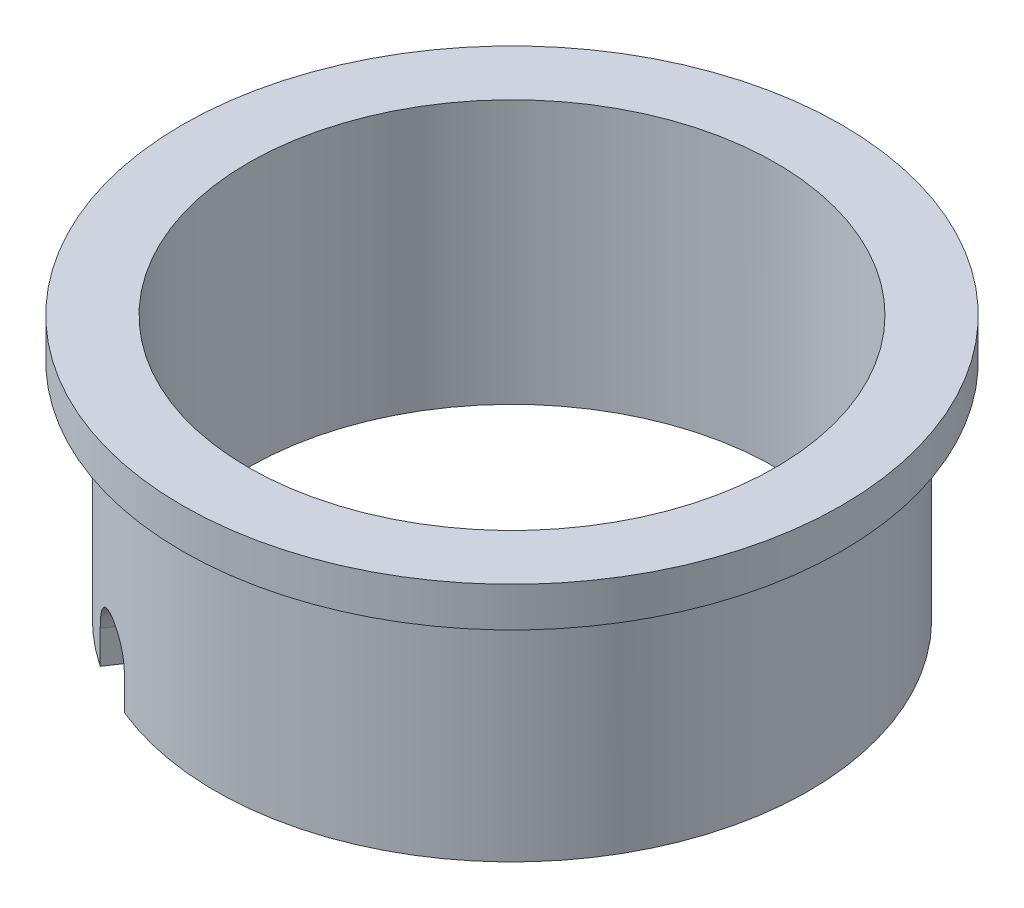
ISO-10303-21;
HEADER;
FILE_DESCRIPTION(('STEP AP214'),'2;1');
FILE_NAME('part.step','',(''),(''),'','','');
FILE_SCHEMA(('AUTOMOTIVE_DESIGN { 1 0 10303 214 1 1 1 1 }'));
ENDSEC;
DATA;
#1=APPLICATION_CONTEXT('core data for automotive mechanical design processes');
#2=APPLICATION_PROTOCOL_DEFINITION('international standard','automotive_design',2000,#1);
#3=PRODUCT_CONTEXT('',#1,'mechanical');
#4=PRODUCT('Part','Part','',(#3));
#5=PRODUCT_RELATED_PRODUCT_CATEGORY('part','',(#4));
#6=PRODUCT_DEFINITION_FORMATION('','',#4);
#7=PRODUCT_DEFINITION_CONTEXT('part definition',#1,'design');
#8=PRODUCT_DEFINITION('design','',#6,#7);
#9=PRODUCT_DEFINITION_SHAPE('','',#8);
#10=(LENGTH_UNIT() NAMED_UNIT(*) SI_UNIT(.MILLI.,.METRE.));
#11=(NAMED_UNIT(*) PLANE_ANGLE_UNIT() SI_UNIT($,.RADIAN.));
#12=(NAMED_UNIT(*) SI_UNIT($,.STERADIAN.) SOLID_ANGLE_UNIT());
#13=UNCERTAINTY_MEASURE_WITH_UNIT(LENGTH_MEASURE(1.E-05),#10,'distance_accuracy_value','');
#14=(GEOMETRIC_REPRESENTATION_CONTEXT(3) GLOBAL_UNCERTAINTY_ASSIGNED_CONTEXT((#13)) GLOBAL_UNIT_ASSIGNED_CONTEXT((#10,
#11,#12)) REPRESENTATION_CONTEXT('',''));
#15=CARTESIAN_POINT('',(0.,0.,0.));
#16=DIRECTION('',(0.,0.,1.));
#17=DIRECTION('',(1.,0.,0.));
#18=AXIS2_PLACEMENT_3D('',#15,#16,#17);
#19=CARTESIAN_POINT('',(0.,20.,0.));
#20=DIRECTION('',(0.,-1.,0.));
#21=DIRECTION('',(0.,0.,-1.));
#22=AXIS2_PLACEMENT_3D('',#19,#20,#21);
#23=CYLINDRICAL_SURFACE('',#22,25.);
#24=CARTESIAN_POINT('',(0.,20.,0.));
#25=DIRECTION('',(0.,1.,0.));
#26=DIRECTION('',(0.,0.,1.));
#27=AXIS2_PLACEMENT_3D('',#24,#25,#26);
#28=CIRCLE('',#27,25.);
#29=CARTESIAN_POINT('',(0.,20.,25.));
#30=VERTEX_POINT('',#29);
#31=EDGE_CURVE('E196',#30,#30,#28,.T.);
#32=ORIENTED_EDGE('',*,*,#31,.F.);
#33=EDGE_LOOP('',(#32));
#34=FACE_BOUND('',#33,.T.);
#35=CARTESIAN_POINT('',(0.,17.,0.));
#36=DIRECTION('',(0.,-1.,0.));
#37=DIRECTION('',(0.,0.,-1.));
#38=AXIS2_PLACEMENT_3D('',#35,#36,#37);
#39=CIRCLE('',#38,25.);
#40=CARTESIAN_POINT('',(0.,17.,-25.));
#41=VERTEX_POINT('',#40);
#42=EDGE_CURVE('E59',#41,#41,#39,.T.);
#43=ORIENTED_EDGE('',*,*,#42,.F.);
#44=EDGE_LOOP('',(#43));
#45=FACE_BOUND('',#44,.T.);
#46=ADVANCED_FACE('F56',(#34,#45),#23,.T.);
#47=CARTESIAN_POINT('',(0.,0.,0.));
#48=DIRECTION('',(0.,1.,0.));
#49=DIRECTION('',(0.,0.,1.));
#50=AXIS2_PLACEMENT_3D('',#47,#48,#49);
#51=PLANE('',#50);
#52=CARTESIAN_POINT('',(0.,0.,0.));
#53=DIRECTION('',(0.,-1.,0.));
#54=DIRECTION('',(0.,0.,-1.));
#55=AXIS2_PLACEMENT_3D('',#52,#53,#54);
#56=CIRCLE('',#55,22.5);
#57=CARTESIAN_POINT('',(-12.5484491130347,0.,18.675824609842));
#58=VERTEX_POINT('',#57);
#59=CARTESIAN_POINT('',(-8.58800200214361,0.,20.7965435015336));
#60=VERTEX_POINT('',#59);
#61=EDGE_CURVE('E71',#58,#60,#56,.T.);
#62=ORIENTED_EDGE('',*,*,#61,.T.);
#63=DIRECTION('',(-0.381688977873049,0.,0.92429082229038));
#64=VECTOR('',#63,1.);
#65=CARTESIAN_POINT('',(-9.54222444682623,0.,23.1072705572595));
#66=LINE('',#65,#64);
#67=CARTESIAN_POINT('',(-7.63377955746099,0.,18.4858164458076));
#68=VERTEX_POINT('',#67);
#69=EDGE_CURVE('E108',#68,#60,#66,.T.);
#70=ORIENTED_EDGE('',*,*,#69,.F.);
#71=CARTESIAN_POINT('',(0.,0.,0.));
#72=DIRECTION('',(0.,1.,0.));
#73=DIRECTION('',(0.,0.,1.));
#74=AXIS2_PLACEMENT_3D('',#71,#72,#73);
#75=CIRCLE('',#74,20.);
#76=CARTESIAN_POINT('',(-11.1541769893642,0.,16.6007329865262));
#77=VERTEX_POINT('',#76);
#78=EDGE_CURVE('E116',#68,#77,#75,.T.);
#79=ORIENTED_EDGE('',*,*,#78,.T.);
#80=DIRECTION('',(-0.557708849468208,0.,0.83003664932631));
#81=VECTOR('',#80,1.);
#82=CARTESIAN_POINT('',(-13.9427212367052,0.,20.7509162331578));
#83=LINE('',#82,#81);
#84=EDGE_CURVE('E78',#77,#58,#83,.T.);
#85=ORIENTED_EDGE('',*,*,#84,.T.);
#86=EDGE_LOOP('',(#62,#70,#79,#85));
#87=FACE_BOUND('',#86,.T.);
#88=ADVANCED_FACE('F106',(#87),#51,.F.);
#89=CARTESIAN_POINT('',(-9.54222444682623,1.25,23.1072705572595));
#90=DIRECTION('',(0.92429082229038,0.,0.381688977873049));
#91=DIRECTION('',(0.,1.,0.));
#92=AXIS2_PLACEMENT_3D('',#89,#90,#91);
#93=PLANE('',#92);
#94=DIRECTION('',(0.,-1.,0.));
#95=VECTOR('',#94,1.);
#96=CARTESIAN_POINT('',(-8.58800200214361,17.,20.7965435015336));
#97=LINE('',#96,#95);
#98=CARTESIAN_POINT('',(-8.5880020021436,2.5,20.7965435015336));
#99=VERTEX_POINT('',#98);
#100=EDGE_CURVE('E95',#99,#60,#97,.T.);
#101=ORIENTED_EDGE('',*,*,#100,.F.);
#102=CARTESIAN_POINT('',(-5.72533466809573,2.5,13.8643623343557));
#103=CARTESIAN_POINT('',(-9.54222444682622,2.5,23.1072705572595));
#104=B_SPLINE_CURVE_WITH_KNOTS('',1,(#102,#103),.UNSPECIFIED.,.F.,.F.,(2,2),(0.,1.),.UNSPECIFIED.);
#105=CARTESIAN_POINT('',(-7.63377955746098,2.5,18.4858164458076));
#106=VERTEX_POINT('',#105);
#107=EDGE_CURVE('E114',#106,#99,#104,.T.);
#108=ORIENTED_EDGE('',*,*,#107,.F.);
#109=DIRECTION('',(0.,-1.,0.));
#110=VECTOR('',#109,1.);
#111=CARTESIAN_POINT('',(-7.63377955746099,20.,18.4858164458076));
#112=LINE('',#111,#110);
#113=EDGE_CURVE('E64',#106,#68,#112,.T.);
#114=ORIENTED_EDGE('',*,*,#113,.T.);
#115=ORIENTED_EDGE('',*,*,#69,.T.);
#116=EDGE_LOOP('',(#101,#108,#114,#115));
#117=FACE_BOUND('',#116,.T.);
#118=ADVANCED_FACE('F112',(#117),#93,.F.);
#119=CARTESIAN_POINT('',(-9.54222444682622,2.5,23.1072705572595));
#120=CARTESIAN_POINT('',(-9.54816404403079,2.55452523592029,23.1048177807834));
#121=CARTESIAN_POINT('',(-9.55345193093015,2.60221003048423,23.1026314817865));
#122=CARTESIAN_POINT('',(-9.5604070250242,2.66347656032638,23.0997537608266));
#123=CARTESIAN_POINT('',(-9.56256259824597,2.68218862660477,23.0988614699295));
#124=CARTESIAN_POINT('',(-9.56555185554634,2.70769156051884,23.0976236626616));
#125=CARTESIAN_POINT('',(-9.566507590759,2.71576501090628,23.0972278314294));
#126=CARTESIAN_POINT('',(-9.56788017714168,2.72723389511157,23.0966592640821));
#127=CARTESIAN_POINT('',(-9.56832753652159,2.73094997461735,23.0964739381964));
#128=CARTESIAN_POINT('',(-9.56920191791917,2.73816836983696,23.0961116830958));
#129=CARTESIAN_POINT('',(-9.569352025233,2.73941511053532,23.0960494972869));
#130=CARTESIAN_POINT('',(-9.57559594389737,2.79027419003512,23.0934622439419));
#131=CARTESIAN_POINT('',(-9.58123288645737,2.83310582339683,23.0911241559143));
#132=CARTESIAN_POINT('',(-9.58981836723185,2.89378861748221,23.087559275194));
#133=CARTESIAN_POINT('',(-9.59270187193594,2.91342210618447,23.0863613567492));
#134=CARTESIAN_POINT('',(-9.59705963001892,2.94198117524857,23.08455000498));
#135=CARTESIAN_POINT('',(-9.59851763288166,2.95135233760505,23.0839438087009));
#136=CARTESIAN_POINT('',(-9.60144446963772,2.96979760765492,23.0827265852296));
#137=CARTESIAN_POINT('',(-9.60254671005601,2.97665223847019,23.0822681003542));
#138=CARTESIAN_POINT('',(-9.61911428403199,3.07695775362982,23.0753742075529));
#139=CARTESIAN_POINT('',(-9.63600549797149,3.16063112854744,23.0683294702462));
#140=CARTESIAN_POINT('',(-9.66458003197332,3.27791056642075,23.0563657030282));
#141=CARTESIAN_POINT('',(-9.67464447064066,3.31563194162801,23.0521449467612));
#142=CARTESIAN_POINT('',(-9.6958507325797,3.3883311505415,23.0432335155317));
#143=CARTESIAN_POINT('',(-9.70579665594246,3.41986795925818,23.0390474317542));
#144=CARTESIAN_POINT('',(-9.74442289067759,3.5310092230939,23.0227496985945));
#145=CARTESIAN_POINT('',(-9.77457307712127,3.60407172504525,23.0099789268468));
#146=CARTESIAN_POINT('',(-9.84362756998843,3.7481333810697,22.9805223029696));
#147=CARTESIAN_POINT('',(-9.88429362459429,3.82198242138376,22.9630743396985));
#148=CARTESIAN_POINT('',(-10.0087646698676,4.02333520306275,22.9092296713369));
#149=CARTESIAN_POINT('',(-10.1073355213614,4.15202273054989,22.8660361532137));
#150=CARTESIAN_POINT('',(-10.4294700267859,4.50020619758414,22.721829102565));
#151=CARTESIAN_POINT('',(-10.6795745588802,4.68477479763454,22.6061368326651));
#152=CARTESIAN_POINT('',(-11.2211540384737,4.93514041226771,22.3422567638255));
#153=CARTESIAN_POINT('',(-11.5133868092738,4.99997724727119,22.1934509475631));
#154=CARTESIAN_POINT('',(-12.0910303687219,4.99998187634069,21.8841112546179));
#155=CARTESIAN_POINT('',(-12.377368876869,4.93408252496173,21.7230617916473));
#156=CARTESIAN_POINT('',(-12.7670951429592,4.74671347359894,21.4947423825009));
#157=CARTESIAN_POINT('',(-12.8912827332236,4.66886285113557,21.4203926906627));
#158=CARTESIAN_POINT('',(-13.1229245479395,4.48679157036113,21.2792679582544));
#159=CARTESIAN_POINT('',(-13.2292884412465,4.38418006963062,21.2132005583282));
#160=CARTESIAN_POINT('',(-13.3791749543203,4.2079487382008,21.1187396685758));
#161=CARTESIAN_POINT('',(-13.4262351203667,4.14696520926396,21.08883501837));
#162=CARTESIAN_POINT('',(-13.5146203156019,4.02051864780314,21.0323034797551));
#163=CARTESIAN_POINT('',(-13.5547470166413,3.95716355357617,21.0064530468155));
#164=CARTESIAN_POINT('',(-13.6738071546031,3.74773138573252,20.929308232036));
#165=CARTESIAN_POINT('',(-13.7374094102113,3.60587590212176,20.887489856334));
#166=CARTESIAN_POINT('',(-13.8004031802176,3.41714970022921,20.8458413161014));
#167=CARTESIAN_POINT('',(-13.8120344141558,3.37904475915914,20.8381349747247));
#168=CARTESIAN_POINT('',(-13.8333681936178,3.30211547563586,20.8239786856995));
#169=CARTESIAN_POINT('',(-13.8436791761202,3.26056359918094,20.8171237759456));
#170=CARTESIAN_POINT('',(-13.8599440317464,3.18765058089487,20.8062982500791));
#171=CARTESIAN_POINT('',(-13.8675530500786,3.14962336834507,20.8012270065802));
#172=CARTESIAN_POINT('',(-13.8781831676933,3.09022649441025,20.7941349930205));
#173=CARTESIAN_POINT('',(-13.8815959695417,3.07003486058028,20.7918567934188));
#174=CARTESIAN_POINT('',(-13.8881606873003,3.02886624121698,20.787472388517));
#175=CARTESIAN_POINT('',(-13.8918206166286,3.00429642184667,20.7850265599362));
#176=CARTESIAN_POINT('',(-13.8993613496223,2.95096593920246,20.7799853378195));
#177=CARTESIAN_POINT('',(-13.9041960901374,2.91301200024879,20.7767505231907));
#178=CARTESIAN_POINT('',(-13.911159978649,2.85248066603196,20.772087903059));
#179=CARTESIAN_POINT('',(-13.913433237454,2.83170348366197,20.7705652961498));
#180=CARTESIAN_POINT('',(-13.9167711167036,2.7996376036604,20.7683288561926));
#181=CARTESIAN_POINT('',(-13.917871741607,2.78879895925211,20.7675912879101));
#182=CARTESIAN_POINT('',(-13.9195046823964,2.77231596602804,20.7664968115982));
#183=CARTESIAN_POINT('',(-13.920045996564,2.76678413051807,20.766133965511));
#184=CARTESIAN_POINT('',(-13.921122626977,2.75564545062759,20.7654122334395));
#185=CARTESIAN_POINT('',(-13.9218715126876,2.74777405548762,20.7649101546694));
#186=CARTESIAN_POINT('',(-13.927290233477,2.69031748853017,20.7612770429593));
#187=CARTESIAN_POINT('',(-13.9341350518496,2.60885273608514,20.7566853654979));
#188=CARTESIAN_POINT('',(-13.9427212367052,2.5,20.7509162331578));
#189=CARTESIAN_POINT('',(-5.72533466809573,2.5,13.8643623343557));
#190=CARTESIAN_POINT('',(-5.72889842641819,2.55452523591594,13.8628906684702));
#191=CARTESIAN_POINT('',(-5.73207115855809,2.60221003048423,13.8615788890719));
#192=CARTESIAN_POINT('',(-5.73624421501452,2.66347656032638,13.859852256496));
#193=CARTESIAN_POINT('',(-5.73753755894758,2.68218862660477,13.8593168819577));
#194=CARTESIAN_POINT('',(-5.7393311133278,2.70769156051884,13.858574197597));
#195=CARTESIAN_POINT('',(-5.7399045544554,2.71576501090628,13.8583366988576));
#196=CARTESIAN_POINT('',(-5.74072810628501,2.72723389511157,13.8579955584493));
#197=CARTESIAN_POINT('',(-5.74099652191295,2.73094997461735,13.8578843629178));
#198=CARTESIAN_POINT('',(-5.7415211507515,2.73816836983696,13.8576670098575));
#199=CARTESIAN_POINT('',(-5.7416112151398,2.73941511053532,13.8576296983721));
#200=CARTESIAN_POINT('',(-5.74535756633842,2.79027419003512,13.8560773463652));
#201=CARTESIAN_POINT('',(-5.74873973187442,2.83310582339683,13.8546744935486));
#202=CARTESIAN_POINT('',(-5.75389102033911,2.89378861748221,13.8525355651164));
#203=CARTESIAN_POINT('',(-5.75562112316157,2.91342210618447,13.8518168140495));
#204=CARTESIAN_POINT('',(-5.75823577801135,2.94198117524857,13.850730002988));
#205=CARTESIAN_POINT('',(-5.759110579729,2.95135233760505,13.8503662852206));
#206=CARTESIAN_POINT('',(-5.76086668178263,2.96979760765492,13.8496359511378));
#207=CARTESIAN_POINT('',(-5.7615280260336,2.97665223847019,13.8493608602125));
#208=CARTESIAN_POINT('',(-5.77146857041919,3.07695775362982,13.8452245245317));
#209=CARTESIAN_POINT('',(-5.78160329878289,3.16063112854744,13.8409976821477));
#210=CARTESIAN_POINT('',(-5.79874801918399,3.27791056642075,13.8338194218169));
#211=CARTESIAN_POINT('',(-5.8047866823844,3.31563194162801,13.8312869680567));
#212=CARTESIAN_POINT('',(-5.81751043954782,3.3883311505415,13.825940109319));
#213=CARTESIAN_POINT('',(-5.82347799356548,3.41986795925818,13.8234284590525));
#214=CARTESIAN_POINT('',(-5.84665373440655,3.5310092230939,13.8136498191567));
#215=CARTESIAN_POINT('',(-5.86474384627276,3.60407172504525,13.8059873561081));
#216=CARTESIAN_POINT('',(-5.90617654199305,3.7481333810697,13.7883133817818));
#217=CARTESIAN_POINT('',(-5.93057617475657,3.82198242138376,13.7778446038191));
#218=CARTESIAN_POINT('',(-6.00525880192054,4.02333520306275,13.7455378028022));
#219=CARTESIAN_POINT('',(-6.06440131281683,4.15202273054989,13.7196216919282));
#220=CARTESIAN_POINT('',(-6.25768201607156,4.50020619758414,13.633097461539));
#221=CARTESIAN_POINT('',(-6.40774473532814,4.68477479763454,13.5636820995991));
#222=CARTESIAN_POINT('',(-6.73269242308421,4.93514041226771,13.4053540582953));
#223=CARTESIAN_POINT('',(-6.9080320855643,4.99997724727119,13.3160705685379));
#224=CARTESIAN_POINT('',(-7.25461822123313,4.99998187634069,13.1304667527708));
#225=CARTESIAN_POINT('',(-7.4264213261214,4.93408252496173,13.0338370749884));
#226=CARTESIAN_POINT('',(-7.66025708577552,4.74671347359894,12.8968454295005));
#227=CARTESIAN_POINT('',(-7.73476963993418,4.66886285113557,12.8522356143976));
#228=CARTESIAN_POINT('',(-7.87375472876368,4.48679157036113,12.7675607749526));
#229=CARTESIAN_POINT('',(-7.93757306474788,4.38418006963062,12.7279203349969));
#230=CARTESIAN_POINT('',(-8.0275049725922,4.2079487382008,12.6712438011455));
#231=CARTESIAN_POINT('',(-8.05574107222004,4.14696520926396,12.653301011022));
#232=CARTESIAN_POINT('',(-8.10877218936115,4.02051864780314,12.6193820878531));
#233=CARTESIAN_POINT('',(-8.13284820998478,3.95716355357617,12.6038718280893));
#234=CARTESIAN_POINT('',(-8.20428429276187,3.74773138573252,12.5575849392216));
#235=CARTESIAN_POINT('',(-8.24244564612678,3.60587590212176,12.5324939138004));
#236=CARTESIAN_POINT('',(-8.28024190813056,3.41714970022921,12.5075047896608));
#237=CARTESIAN_POINT('',(-8.28722064849345,3.37904475915914,12.5028809848348));
#238=CARTESIAN_POINT('',(-8.3000209161707,3.30211547563586,12.4943872114197));
#239=CARTESIAN_POINT('',(-8.30620750567213,3.26056359918094,12.4902742655674));
#240=CARTESIAN_POINT('',(-8.31596641904783,3.18765058089487,12.4837789500474));
#241=CARTESIAN_POINT('',(-8.32053183004714,3.14962336834507,12.4807362039481));
#242=CARTESIAN_POINT('',(-8.32690990061599,3.09022649441025,12.4764809958123));
#243=CARTESIAN_POINT('',(-8.32895758172504,3.07003486058028,12.4751140760513));
#244=CARTESIAN_POINT('',(-8.33289641238018,3.02886624121698,12.4724834331102));
#245=CARTESIAN_POINT('',(-8.33509236997715,3.00429642184667,12.4710159359617));
#246=CARTESIAN_POINT('',(-8.33961680977339,2.95096593920246,12.4679912026917));
#247=CARTESIAN_POINT('',(-8.34251765408242,2.91301200024879,12.4660503139144));
#248=CARTESIAN_POINT('',(-8.34669598718938,2.85248066603196,12.4632527418354));
#249=CARTESIAN_POINT('',(-8.34805994247241,2.83170348366197,12.4623391776899));
#250=CARTESIAN_POINT('',(-8.35006267002218,2.7996376036604,12.4609973137155));
#251=CARTESIAN_POINT('',(-8.35072304496418,2.78879895925211,12.460554772746));
#252=CARTESIAN_POINT('',(-8.35170280943783,2.77231596602804,12.4598980869589));
#253=CARTESIAN_POINT('',(-8.35202759793839,2.76678413051807,12.4596803793066));
#254=CARTESIAN_POINT('',(-8.35267357618619,2.75564545062759,12.4592473400637));
#255=CARTESIAN_POINT('',(-8.35312290761256,2.74777405548762,12.4589460928016));
#256=CARTESIAN_POINT('',(-8.35637414008618,2.69031748853017,12.4567662257756));
#257=CARTESIAN_POINT('',(-8.36048103111074,2.60885273606468,12.4540112192981));
#258=CARTESIAN_POINT('',(-8.36563274202311,2.5,12.4505497398947));
#259=B_SPLINE_SURFACE_WITH_KNOTS('',1,3,((#119,#120,#121,#122,#123,#124,#125,#126,#127,#128,
#129,#130,#131,#132,#133,#134,#135,#136,#137,#138,#139,#140,#141,#142,#143,#144,#145,#146,#147,
#148,#149,#150,#151,#152,#153,#154,#155,#156,#157,#158,#159,#160,#161,#162,#163,#164,#165,#166,
#167,#168,#169,#170,#171,#172,#173,#174,#175,#176,#177,#178,#179,#180,#181,#182,#183,#184,#185,
#186,#187,#188),(#189,#190,#191,#192,#193,#194,#195,#196,#197,#198,#199,#200,#201,#202,#203,
#204,#205,#206,#207,#208,#209,#210,#211,#212,#213,#214,#215,#216,#217,#218,#219,#220,#221,#222,
#223,#224,#225,#226,#227,#228,#229,#230,#231,#232,#233,#234,#235,#236,#237,#238,#239,#240,#241,
#242,#243,#244,#245,#246,#247,#248,#249,#250,#251,#252,#253,#254,#255,#256,#257,#258)),
.UNSPECIFIED.,.F.,.F.,.F.,(2,2),(4,2,2,2,2,2,2,2,2,2,2,2,2,2,2,2,2,2,2,2,2,2,2,2,2,2,2,2,2,2,2,
2,2,2,4),(0.,1.),(0.,0.015625,0.0234375,0.02734375,0.029296875,0.03125,0.046875,0.0546875,
0.05859375,0.0625,0.09375,0.109375,0.125,0.15625,0.1875,0.25,0.375,0.5,0.625,0.6875,0.75,
0.78125,0.8125,0.875,0.890625,0.90625,0.921875,0.9296875,0.9375,0.953125,0.9609375,0.96484375,
0.966796875,0.96875,1.),.UNSPECIFIED.);
#260=CARTESIAN_POINT('',(-12.5484491130347,2.5,18.675824609842));
#261=CARTESIAN_POINT('',(-12.5463638953014,2.52916944996656,18.6772256615657));
#262=CARTESIAN_POINT('',(-12.5442757818079,2.5583386733914,18.6786282024294));
#263=CARTESIAN_POINT('',(-12.5400096269691,2.61666961373724,18.6814925888757));
#264=CARTESIAN_POINT('',(-12.5378315793758,2.64583132999457,18.6829544385786));
#265=CARTESIAN_POINT('',(-12.5332852700213,2.70434744322804,18.6860046040114));
#266=CARTESIAN_POINT('',(-12.530915743973,2.73370170473565,18.6875937595946));
#267=CARTESIAN_POINT('',(-12.5258193197044,2.79236356661655,18.6910101195468));
#268=CARTESIAN_POINT('',(-12.5230924340448,2.82167116859325,18.692837315549));
#269=CARTESIAN_POINT('',(-12.5142903972472,2.90963477254574,18.6987322736718));
#270=CARTESIAN_POINT('',(-12.5076026019712,2.96821029185495,18.7032075400535));
#271=CARTESIAN_POINT('',(-12.4956079676437,3.05562407089229,18.7112213208565));
#272=CARTESIAN_POINT('',(-12.4912881724043,3.08465677093295,18.7141056785885));
#273=CARTESIAN_POINT('',(-12.4819072012009,3.14254821817096,18.7203639027181));
#274=CARTESIAN_POINT('',(-12.4768460518726,3.17140697157915,18.7237377515289));
#275=CARTESIAN_POINT('',(-12.460330183844,3.2574534598698,18.7347364171363));
#276=CARTESIAN_POINT('',(-12.4475215726011,3.31428103311983,18.7432527314423));
#277=CARTESIAN_POINT('',(-12.4180932191859,3.42643003459364,18.7627627998932));
#278=CARTESIAN_POINT('',(-12.4014779589415,3.48175314913581,18.7737536402835));
#279=CARTESIAN_POINT('',(-12.372365715175,3.56825191417794,18.7929437229557));
#280=CARTESIAN_POINT('',(-12.3609967598708,3.59997565594802,18.8004245833931));
#281=CARTESIAN_POINT('',(-12.337062548661,3.66278120311245,18.8161391405045));
#282=CARTESIAN_POINT('',(-12.3244973037595,3.69386301440848,18.8243728302535));
#283=CARTESIAN_POINT('',(-12.2982080269752,3.75537590291475,18.8415584896589));
#284=CARTESIAN_POINT('',(-12.2844826131106,3.78580614835802,18.8505113152936));
#285=CARTESIAN_POINT('',(-12.255958028091,3.84595619545608,18.8690694503626));
#286=CARTESIAN_POINT('',(-12.2411588113858,3.87567596690186,18.878674787475));
#287=CARTESIAN_POINT('',(-12.2105750101027,3.93437906256522,18.8984705933181));
#288=CARTESIAN_POINT('',(-12.1947910782481,3.96336285707047,18.9086606740965));
#289=CARTESIAN_POINT('',(-12.1621653054519,4.0204960184137,18.9296621709996));
#290=CARTESIAN_POINT('',(-12.145323514193,4.0486454243477,18.9404735579424));
#291=CARTESIAN_POINT('',(-12.1106811426326,4.10410493226122,18.9626429113783));
#292=CARTESIAN_POINT('',(-12.0928810592487,4.13141545791578,18.974000594273));
#293=CARTESIAN_POINT('',(-12.0563042292676,4.18513569402366,18.9972628809124));
#294=CARTESIAN_POINT('',(-12.0375273902312,4.21154531882348,19.0091675364097));
#295=CARTESIAN_POINT('',(-11.9797384052548,4.28949516187887,19.0456806320079));
#296=CARTESIAN_POINT('',(-11.9393268725629,4.33966193146767,19.0710503166104));
#297=CARTESIAN_POINT('',(-11.8547594320221,4.43564684258706,19.1237327948107));
#298=CARTESIAN_POINT('',(-11.8106029506187,4.48146431571938,19.1510458859458));
#299=CARTESIAN_POINT('',(-11.7187947936103,4.56824744031597,19.207361820754));
#300=CARTESIAN_POINT('',(-11.6711453061928,4.60921608796164,19.2363636042452));
#301=CARTESIAN_POINT('',(-11.5725488600132,4.68575696766219,19.2958395706174));
#302=CARTESIAN_POINT('',(-11.5216025782222,4.72133030261785,19.3263134508909));
#303=CARTESIAN_POINT('',(-11.4197637976507,4.7846086798899,19.3866523560008));
#304=CARTESIAN_POINT('',(-11.3690409623324,4.8126513048948,19.4164494806903));
#305=CARTESIAN_POINT('',(-11.2653022646908,4.8631116112002,19.4768212313629));
#306=CARTESIAN_POINT('',(-11.2122861903351,4.88552877106268,19.507395929132));
#307=CARTESIAN_POINT('',(-11.1044275904726,4.92456048085901,19.5689944623254));
#308=CARTESIAN_POINT('',(-11.0495854513086,4.94117624976253,19.6000182019699));
#309=CARTESIAN_POINT('',(-10.9385204788499,4.96839844887736,19.6622180767289));
#310=CARTESIAN_POINT('',(-10.8822978542825,4.9790057817882,19.693394188241));
#311=CARTESIAN_POINT('',(-10.7747782872111,4.993248880889,19.7524053038585));
#312=CARTESIAN_POINT('',(-10.7235691923756,4.99748926803975,19.7802542837026));
#313=CARTESIAN_POINT('',(-10.6208226616809,5.00083323167994,19.8356129462182));
#314=CARTESIAN_POINT('',(-10.5692852560188,4.99993727397448,19.8631226594305));
#315=CARTESIAN_POINT('',(-10.4148235372248,4.98969816602941,19.9447972755564));
#316=CARTESIAN_POINT('',(-10.3118955948336,4.97282369361246,19.9981922407921));
#317=CARTESIAN_POINT('',(-10.1119986165154,4.92049960953341,20.0999941565856));
#318=CARTESIAN_POINT('',(-10.0149439993874,4.88555224380836,20.1484955878747));
#319=CARTESIAN_POINT('',(-9.82664363814235,4.7982897290421,20.2410005719359));
#320=CARTESIAN_POINT('',(-9.73540054862431,4.74596670997362,20.2850020747029));
#321=CARTESIAN_POINT('',(-9.55796683123171,4.62449691763016,20.3692226174723));
#322=CARTESIAN_POINT('',(-9.47202899502879,4.55486824073683,20.4092769671486));
#323=CARTESIAN_POINT('',(-9.35059638192619,4.44060596038391,20.4650516670774));
#324=CARTESIAN_POINT('',(-9.31135569271651,4.40087086886241,20.4829293454205));
#325=CARTESIAN_POINT('',(-9.23544392450663,4.31842836232567,20.5172685072557));
#326=CARTESIAN_POINT('',(-9.19877283958487,4.27572095416048,20.5337299940114));
#327=CARTESIAN_POINT('',(-9.12360137331576,4.18180474735826,20.5672508880848));
#328=CARTESIAN_POINT('',(-9.08548789542703,4.13021421460993,20.5841074510673));
#329=CARTESIAN_POINT('',(-9.01305203853409,4.02387149934346,20.6159271638339));
#330=CARTESIAN_POINT('',(-8.97872938032534,3.96911955012548,20.6308904530747));
#331=CARTESIAN_POINT('',(-8.93049887687689,3.88465624128466,20.6517916836637));
#332=CARTESIAN_POINT('',(-8.91494329651983,3.85606768375008,20.6585104389585));
#333=CARTESIAN_POINT('',(-8.88494301280697,3.79820485389728,20.6714308551785));
#334=CARTESIAN_POINT('',(-8.87049809025875,3.76893071837584,20.6776326181545));
#335=CARTESIAN_POINT('',(-8.84280956662114,3.7097535982527,20.6894887689206));
#336=CARTESIAN_POINT('',(-8.82956456529294,3.67985139812424,20.6951437952526));
#337=CARTESIAN_POINT('',(-8.80436746345411,3.61940575928496,20.7058760135279));
#338=CARTESIAN_POINT('',(-8.79241531049212,3.58886234664845,20.7109532289138));
#339=CARTESIAN_POINT('',(-8.77090455765334,3.53013052825591,20.720071337349));
#340=CARTESIAN_POINT('',(-8.76122644123723,3.50199397195947,20.7241648575031));
#341=CARTESIAN_POINT('',(-8.74299429431477,3.44529401535005,20.7318631293112));
#342=CARTESIAN_POINT('',(-8.73444021253141,3.4167306345745,20.7354679032615));
#343=CARTESIAN_POINT('',(-8.71840997742662,3.35919722876516,20.7422130860225));
#344=CARTESIAN_POINT('',(-8.71093571512402,3.33022658555709,20.7453526804341));
#345=CARTESIAN_POINT('',(-8.69687525277143,3.27203286776044,20.7512510036354));
#346=CARTESIAN_POINT('',(-8.69028911669448,3.24280977514871,20.7540097049891));
#347=CARTESIAN_POINT('',(-8.67169916462732,3.15468263955015,20.7617874180283));
#348=CARTESIAN_POINT('',(-8.6609054886975,3.09547550014866,20.7662905307936));
#349=CARTESIAN_POINT('',(-8.64188264731875,2.97657921324508,20.7742140727863));
#350=CARTESIAN_POINT('',(-8.63365432132458,2.91688991450803,20.7776341476189));
#351=CARTESIAN_POINT('',(-8.622460988936,2.82728391374265,20.7822804716226));
#352=CARTESIAN_POINT('',(-8.6189257372774,2.79744690864524,20.7837468228491));
#353=CARTESIAN_POINT('',(-8.61219092557448,2.73772801506244,20.7865384607063));
#354=CARTESIAN_POINT('',(-8.6089913679984,2.70784612624867,20.7878637462996));
#355=CARTESIAN_POINT('',(-8.60278611201688,2.64830768109912,20.7904324667669));
#356=CARTESIAN_POINT('',(-8.59977903788412,2.6186512885829,20.7916764842234));
#357=CARTESIAN_POINT('',(-8.59384843062528,2.55932993598695,20.7941284794928));
#358=CARTESIAN_POINT('',(-8.59092489383031,2.52966497634146,20.7953364588886));
#359=CARTESIAN_POINT('',(-8.5880020021436,2.5,20.7965435015336));
#360=B_SPLINE_CURVE_WITH_KNOTS('',3,(#260,#261,#262,#263,#264,#265,#266,#267,#268,#269,#270,
#271,#272,#273,#274,#275,#276,#277,#278,#279,#280,#281,#282,#283,#284,#285,#286,#287,#288,#289,
#290,#291,#292,#293,#294,#295,#296,#297,#298,#299,#300,#301,#302,#303,#304,#305,#306,#307,#308,
#309,#310,#311,#312,#313,#314,#315,#316,#317,#318,#319,#320,#321,#322,#323,#324,#325,#326,#327,
#328,#329,#330,#331,#332,#333,#334,#335,#336,#337,#338,#339,#340,#341,#342,#343,#344,#345,#346,
#347,#348,#349,#350,#351,#352,#353,#354,#355,#356,#357,#358,#359),.UNSPECIFIED.,.F.,.F.,(4,2,2,
2,2,2,2,2,2,2,2,2,2,2,2,2,2,2,2,2,2,2,2,2,2,2,2,2,2,2,2,2,2,2,2,2,2,2,2,2,2,2,2,2,2,2,2,2,2,4),
(0.,0.0878322768357099,0.175670666144768,0.264145727664827,0.352617680198568,0.529926701273441,
0.618395252240655,0.706860625452433,0.88327788399049,1.05948848765435,1.16301907210056,
1.26654870429927,1.37020344645264,1.4738625881436,1.57745373422781,1.68104001876016,
1.78457309704182,1.88811599149029,2.09555371698133,2.30302326998968,2.51036394679496,
2.71766218207448,2.9128876778654,3.10813126290253,3.30333379926065,3.49850700086287,
3.67361474738272,3.84870661397359,4.19836668149923,4.53879390133731,4.87937552308149,
5.23078308216252,5.40657444978841,5.58236541229556,5.78112225761644,5.97986445416,
6.07953666957465,6.17918916355064,6.27872382915857,6.3782544550912,6.46833195765824,
6.55840534957804,6.64863461735082,6.73887038100338,6.91982476554741,7.10083830146506,
7.19108160187263,7.28132556576145,7.37082875005437,7.46032799736551),.UNSPECIFIED.);
#361=CARTESIAN_POINT('',(-12.5484491130347,2.5,18.675824609842));
#362=VERTEX_POINT('',#361);
#363=EDGE_CURVE('E98',#362,#99,#360,.T.);
#364=CARTESIAN_POINT('',(-13.9427212367052,2.5,20.7509162331578));
#365=CARTESIAN_POINT('',(-8.36563274202311,2.5,12.4505497398947));
#366=B_SPLINE_CURVE_WITH_KNOTS('',1,(#364,#365),.UNSPECIFIED.,.F.,.F.,(2,2),(0.,1.),.UNSPECIFIED.);
#367=CARTESIAN_POINT('',(-11.1541769893641,2.5,16.6007329865262));
#368=VERTEX_POINT('',#367);
#369=EDGE_CURVE('E118',#368,#362,#366,.F.);
#370=CARTESIAN_POINT('',(-11.1541769893641,2.5,16.6007329865262));
#371=CARTESIAN_POINT('',(-11.1501005586956,2.56332638833802,16.6034713630973));
#372=CARTESIAN_POINT('',(-11.1461265002348,2.62667544617555,16.606140116569));
#373=CARTESIAN_POINT('',(-11.1394504142647,2.72184766427018,16.6106186897587));
#374=CARTESIAN_POINT('',(-11.1370964055018,2.75370795849832,16.6121971378728));
#375=CARTESIAN_POINT('',(-11.1320068895385,2.81738366636067,16.6156080625461));
#376=CARTESIAN_POINT('',(-11.1292713963035,2.84919908159472,16.6174405298064));
#377=CARTESIAN_POINT('',(-11.1203440299096,2.94467123895812,16.6234172918473));
#378=CARTESIAN_POINT('',(-11.1134386903235,3.00823695710744,16.628035963147));
#379=CARTESIAN_POINT('',(-11.0965913135701,3.13498829869382,16.6392838453545));
#380=CARTESIAN_POINT('',(-11.0866415946324,3.19817254351824,16.6459181419133));
#381=CARTESIAN_POINT('',(-11.0686568559627,3.29201846959978,16.657877553481));
#382=CARTESIAN_POINT('',(-11.0621622435526,3.32310592129414,16.6621918408347));
#383=CARTESIAN_POINT('',(-11.048125069103,3.38494270465229,16.6715027481984));
#384=CARTESIAN_POINT('',(-11.0405824455257,3.41569201634649,16.676499408276));
#385=CARTESIAN_POINT('',(-11.0244994311242,3.47677642230099,16.6871359118942));
#386=CARTESIAN_POINT('',(-11.0159601972377,3.5071119520864,16.6927750094687));
#387=CARTESIAN_POINT('',(-10.99791156007,3.56736958437596,16.7046717530576));
#388=CARTESIAN_POINT('',(-10.9884021791469,3.59729169638967,16.7109293848171));
#389=CARTESIAN_POINT('',(-10.9678308459413,3.6583586751172,16.7244385926568));
#390=CARTESIAN_POINT('',(-10.9567113207154,3.68947615077982,16.7317264759596));
#391=CARTESIAN_POINT('',(-10.9334035862092,3.75114409671495,16.746966290703));
#392=CARTESIAN_POINT('',(-10.9212153309392,3.78169454251839,16.7549182507194));
#393=CARTESIAN_POINT('',(-10.8958084182834,3.84222597469379,16.7714515904267));
#394=CARTESIAN_POINT('',(-10.8825887860844,3.87220638818778,16.7800335651166));
#395=CARTESIAN_POINT('',(-10.8551944233933,3.93155541513495,16.797768345439));
#396=CARTESIAN_POINT('',(-10.8410197198198,3.9609240458007,16.8069211349825));
#397=CARTESIAN_POINT('',(-10.8116620643992,4.01888466162069,16.825821416839));
#398=CARTESIAN_POINT('',(-10.7964810358237,4.04747798903431,16.835567771997));
#399=CARTESIAN_POINT('',(-10.7651549808953,4.10393340921803,16.8556158267503));
#400=CARTESIAN_POINT('',(-10.7490098461171,4.13179541923369,16.8659175887949));
#401=CARTESIAN_POINT('',(-10.6991296618626,4.21414929968793,16.8976381899214));
#402=CARTESIAN_POINT('',(-10.6639280125561,4.26745221438262,16.9198864251003));
#403=CARTESIAN_POINT('',(-10.5957902815178,4.36187585222182,16.9626227658271));
#404=CARTESIAN_POINT('',(-10.5634339451891,4.40355823278466,16.982798449959));
#405=CARTESIAN_POINT('',(-10.4959347764543,4.48382428250329,17.0245976433552));
#406=CARTESIAN_POINT('',(-10.4607925511412,4.5224086231065,17.0462208370233));
#407=CARTESIAN_POINT('',(-10.3878801576177,4.59607156881973,17.0907510011637));
#408=CARTESIAN_POINT('',(-10.3501142011875,4.63115558194772,17.113655903159));
#409=CARTESIAN_POINT('',(-10.271904160983,4.69738829187152,17.1607129264674));
#410=CARTESIAN_POINT('',(-10.2314575675469,4.7285332191835,17.1848662117478));
#411=CARTESIAN_POINT('',(-10.1543451656905,4.78197538040591,17.2305242548156));
#412=CARTESIAN_POINT('',(-10.1180262055912,4.80489876864031,17.2518806861454));
#413=CARTESIAN_POINT('',(-10.0437481940701,4.84721865847272,17.2952299464797));
#414=CARTESIAN_POINT('',(-10.0057885825972,4.86661394376336,17.3172229919383));
#415=CARTESIAN_POINT('',(-9.88981835743931,4.91918885927149,17.3838829596094));
#416=CARTESIAN_POINT('',(-9.80959558596081,4.94684182493274,17.4293024770178));
#417=CARTESIAN_POINT('',(-9.68649714903425,4.97604849761054,17.4978288449925));
#418=CARTESIAN_POINT('',(-9.6448969119721,4.98374230476032,17.5207946456472));
#419=CARTESIAN_POINT('',(-9.56112622650142,4.99485121811101,17.566648624064));
#420=CARTESIAN_POINT('',(-9.51895629393,4.99826996297761,17.589536851279));
#421=CARTESIAN_POINT('',(-9.39202874009609,5.00189920349427,17.6578304097775));
#422=CARTESIAN_POINT('',(-9.3068075182898,4.99549374354006,17.7028901577082));
#423=CARTESIAN_POINT('',(-9.14356503272495,4.96682491811826,17.7877252794456));
#424=CARTESIAN_POINT('',(-9.06543193034162,4.94560221188084,17.8276543024409));
#425=CARTESIAN_POINT('',(-8.91276281884806,4.88943648518754,17.9044672910785));
#426=CARTESIAN_POINT('',(-8.83822416193761,4.8545037429187,17.9413535128468));
#427=CARTESIAN_POINT('',(-8.69120430155446,4.77050773880789,18.0130502924879));
#428=CARTESIAN_POINT('',(-8.61896765532073,4.72087805191341,18.0476921163975));
#429=CARTESIAN_POINT('',(-8.48110317377364,4.61062999235314,18.1128883228825));
#430=CARTESIAN_POINT('',(-8.41549323564014,4.54998303762596,18.1434317058822));
#431=CARTESIAN_POINT('',(-8.30950146886531,4.43869435788653,18.192156025612));
#432=CARTESIAN_POINT('',(-8.26729583749161,4.39020131283074,18.2113639806171));
#433=CARTESIAN_POINT('',(-8.18665369275173,4.28943722020887,18.2477575783946));
#434=CARTESIAN_POINT('',(-8.14821855686441,4.23716480394609,18.2649424825389));
#435=CARTESIAN_POINT('',(-8.07540494325765,4.12947520649594,18.2972516602049));
#436=CARTESIAN_POINT('',(-8.04101608641197,4.0740666362848,18.3123812220345));
#437=CARTESIAN_POINT('',(-7.99254431020221,3.98883420503655,18.3335633557775));
#438=CARTESIAN_POINT('',(-7.97690546983726,3.96006977942062,18.3403721037379));
#439=CARTESIAN_POINT('',(-7.94674112451935,3.90184664639707,18.353462244001));
#440=CARTESIAN_POINT('',(-7.93221551006964,3.8723880076458,18.3597436881751));
#441=CARTESIAN_POINT('',(-7.90430374620669,3.81287710933121,18.3717776231698));
#442=CARTESIAN_POINT('',(-7.89091618167401,3.78282564598512,18.3775307716412));
#443=CARTESIAN_POINT('',(-7.86528090438847,3.72215788589353,18.3885167911427));
#444=CARTESIAN_POINT('',(-7.85303293587084,3.69154171774459,18.3937497789331));
#445=CARTESIAN_POINT('',(-7.81817665492307,3.59886550342147,18.4086054998151));
#446=CARTESIAN_POINT('',(-7.79743986724266,3.53594382579651,18.4173919110337));
#447=CARTESIAN_POINT('',(-7.77467334745706,3.45619917516278,18.4270040472356));
#448=CARTESIAN_POINT('',(-7.77026417593046,3.44014266718921,18.428863651501));
#449=CARTESIAN_POINT('',(-7.76178609414154,3.40792398951163,18.4324360327207));
#450=CARTESIAN_POINT('',(-7.75771715905818,3.39176182760822,18.434148820386));
#451=CARTESIAN_POINT('',(-7.74594419783416,3.34314983999014,18.4391003232144));
#452=CARTESIAN_POINT('',(-7.73867449268251,3.3105762110913,18.4421519769873));
#453=CARTESIAN_POINT('',(-7.71833695597947,3.21247336812775,18.4506773301409));
#454=CARTESIAN_POINT('',(-7.70674606262006,3.14658193727445,18.4555191643113));
#455=CARTESIAN_POINT('',(-7.68932145994248,3.03214267205901,18.4627840925679));
#456=CARTESIAN_POINT('',(-7.6827782714554,2.98371498460957,18.4655072828543));
#457=CARTESIAN_POINT('',(-7.67086330700624,2.88668897198425,18.4704601511043));
#458=CARTESIAN_POINT('',(-7.66549160504318,2.83809063622598,18.4726897978924));
#459=CARTESIAN_POINT('',(-7.65802228186684,2.76535542290604,18.475786899892));
#460=CARTESIAN_POINT('',(-7.65564047805592,2.74125139961579,18.4767739315936));
#461=CARTESIAN_POINT('',(-7.65103828737992,2.69302519944407,18.4786801337185));
#462=CARTESIAN_POINT('',(-7.64881790048536,2.66890302256592,18.4795993041541));
#463=CARTESIAN_POINT('',(-7.64443714057278,2.62065293096792,18.4814119137381));
#464=CARTESIAN_POINT('',(-7.64227676627538,2.59652501638147,18.4823053534352));
#465=CARTESIAN_POINT('',(-7.63799959879958,2.54826521071414,18.4840733467929));
#466=CARTESIAN_POINT('',(-7.63588280457768,2.52413331974245,18.4849479009059));
#467=CARTESIAN_POINT('',(-7.63377955746097,2.5,18.4858164458076));
#468=B_SPLINE_CURVE_WITH_KNOTS('',3,(#370,#371,#372,#373,#374,#375,#376,#377,#378,#379,#380,
#381,#382,#383,#384,#385,#386,#387,#388,#389,#390,#391,#392,#393,#394,#395,#396,#397,#398,#399,
#400,#401,#402,#403,#404,#405,#406,#407,#408,#409,#410,#411,#412,#413,#414,#415,#416,#417,#418,
#419,#420,#421,#422,#423,#424,#425,#426,#427,#428,#429,#430,#431,#432,#433,#434,#435,#436,#437,
#438,#439,#440,#441,#442,#443,#444,#445,#446,#447,#448,#449,#450,#451,#452,#453,#454,#455,#456,
#457,#458,#459,#460,#461,#462,#463,#464,#465,#466,#467),.UNSPECIFIED.,.F.,.F.,(4,2,2,2,2,2,2,2,
2,2,2,2,2,2,2,2,2,2,2,2,2,2,2,2,2,2,2,2,2,2,2,2,2,2,2,2,2,2,2,2,2,2,2,2,2,2,2,2,4),(0.,
0.190569541514602,0.286526435247744,0.382479817171444,0.574738249441045,0.76748585778657,
0.863612321777466,0.959744432567351,1.05576603592564,1.15178542688016,1.25327226397887,
1.35476347040948,1.45635179191568,1.55793725135309,1.65933386800867,1.76074190946967,
1.96340722505589,2.1327370150789,2.30203000612932,2.47105725121028,2.64024504134074,
2.78397549177776,2.92775539951555,3.21482937563424,3.35908420879697,3.50321617750982,
3.79132168028994,4.0609967831137,4.33047009997692,4.61210138006804,4.89447400941676,
5.09552462307443,5.29664841533636,5.49724450595387,5.59754492253911,5.69783546089228,
5.79799940996799,5.8981408242876,6.09830948322021,6.1485714763793,6.19882979960695,
6.29935176923364,6.50045730894035,6.64727060965541,6.79409318140648,6.86681749035158,
6.93954178602139,7.01226453013513,7.08498553088844),.UNSPECIFIED.);
#469=EDGE_CURVE('E173',#368,#106,#468,.T.);
#470=ORIENTED_EDGE('',*,*,#363,.F.);
#471=ORIENTED_EDGE('',*,*,#369,.F.);
#472=ORIENTED_EDGE('',*,*,#469,.T.);
#473=ORIENTED_EDGE('',*,*,#107,.T.);
#474=EDGE_LOOP('',(#470,#471,#472,#473));
#475=FACE_BOUND('',#474,.T.);
#476=ADVANCED_FACE('F132',(#475),#259,.F.);
#477=CARTESIAN_POINT('',(-13.9427212367052,1.25,20.7509162331578));
#478=DIRECTION('',(-0.83003664932631,0.,-0.557708849468208));
#479=DIRECTION('',(0.,-1.,0.));
#480=AXIS2_PLACEMENT_3D('',#477,#478,#479);
#481=PLANE('',#480);
#482=DIRECTION('',(0.,-1.,0.));
#483=VECTOR('',#482,1.);
#484=CARTESIAN_POINT('',(-12.5484491130347,17.,18.675824609842));
#485=LINE('',#484,#483);
#486=EDGE_CURVE('E13',#58,#362,#485,.F.);
#487=ORIENTED_EDGE('',*,*,#486,.F.);
#488=ORIENTED_EDGE('',*,*,#84,.F.);
#489=DIRECTION('',(0.,-1.,0.));
#490=VECTOR('',#489,1.);
#491=CARTESIAN_POINT('',(-11.1541769893642,20.,16.6007329865262));
#492=LINE('',#491,#490);
#493=EDGE_CURVE('E203',#77,#368,#492,.F.);
#494=ORIENTED_EDGE('',*,*,#493,.T.);
#495=ORIENTED_EDGE('',*,*,#369,.T.);
#496=EDGE_LOOP('',(#487,#488,#494,#495));
#497=FACE_BOUND('',#496,.T.);
#498=ADVANCED_FACE('F144',(#497),#481,.F.);
#499=CARTESIAN_POINT('',(0.,20.,0.));
#500=DIRECTION('',(0.,1.,0.));
#501=DIRECTION('',(0.,0.,1.));
#502=AXIS2_PLACEMENT_3D('',#499,#500,#501);
#503=PLANE('',#502);
#504=CARTESIAN_POINT('',(0.,20.,0.));
#505=DIRECTION('',(0.,1.,0.));
#506=DIRECTION('',(0.,0.,1.));
#507=AXIS2_PLACEMENT_3D('',#504,#505,#506);
#508=CIRCLE('',#507,20.);
#509=CARTESIAN_POINT('',(0.,20.,20.));
#510=VERTEX_POINT('',#509);
#511=EDGE_CURVE('E217',#510,#510,#508,.T.);
#512=ORIENTED_EDGE('',*,*,#511,.F.);
#513=EDGE_LOOP('',(#512));
#514=FACE_BOUND('',#513,.T.);
#515=ORIENTED_EDGE('',*,*,#31,.T.);
#516=EDGE_LOOP('',(#515));
#517=FACE_BOUND('',#516,.T.);
#518=ADVANCED_FACE('F180',(#514,#517),#503,.T.);
#519=CARTESIAN_POINT('',(0.,20.,0.));
#520=DIRECTION('',(0.,-1.,0.));
#521=DIRECTION('',(0.,0.,-1.));
#522=AXIS2_PLACEMENT_3D('',#519,#520,#521);
#523=CYLINDRICAL_SURFACE('',#522,20.);
#524=ORIENTED_EDGE('',*,*,#113,.F.);
#525=ORIENTED_EDGE('',*,*,#469,.F.);
#526=ORIENTED_EDGE('',*,*,#493,.F.);
#527=ORIENTED_EDGE('',*,*,#78,.F.);
#528=EDGE_LOOP('',(#524,#525,#526,#527));
#529=FACE_BOUND('',#528,.T.);
#530=ORIENTED_EDGE('',*,*,#511,.T.);
#531=EDGE_LOOP('',(#530));
#532=FACE_BOUND('',#531,.T.);
#533=ADVANCED_FACE('F176',(#529,#532),#523,.F.);
#534=CARTESIAN_POINT('',(0.,17.,0.));
#535=DIRECTION('',(0.,-1.,0.));
#536=DIRECTION('',(0.,0.,-1.));
#537=AXIS2_PLACEMENT_3D('',#534,#535,#536);
#538=PLANE('',#537);
#539=CARTESIAN_POINT('',(0.,17.,0.));
#540=DIRECTION('',(0.,-1.,0.));
#541=DIRECTION('',(0.,0.,-1.));
#542=AXIS2_PLACEMENT_3D('',#539,#540,#541);
#543=CIRCLE('',#542,22.5);
#544=CARTESIAN_POINT('',(0.,17.,-22.5));
#545=VERTEX_POINT('',#544);
#546=EDGE_CURVE('E110',#545,#545,#543,.T.);
#547=ORIENTED_EDGE('',*,*,#546,.F.);
#548=EDGE_LOOP('',(#547));
#549=FACE_BOUND('',#548,.T.);
#550=ORIENTED_EDGE('',*,*,#42,.T.);
#551=EDGE_LOOP('',(#550));
#552=FACE_BOUND('',#551,.T.);
#553=ADVANCED_FACE('F146',(#549,#552),#538,.T.);
#554=CARTESIAN_POINT('',(0.,17.,0.));
#555=DIRECTION('',(0.,-1.,0.));
#556=DIRECTION('',(0.,0.,-1.));
#557=AXIS2_PLACEMENT_3D('',#554,#555,#556);
#558=CYLINDRICAL_SURFACE('',#557,22.5);
#559=ORIENTED_EDGE('',*,*,#546,.T.);
#560=EDGE_LOOP('',(#559));
#561=FACE_BOUND('',#560,.T.);
#562=ORIENTED_EDGE('',*,*,#100,.T.);
#563=ORIENTED_EDGE('',*,*,#61,.F.);
#564=ORIENTED_EDGE('',*,*,#486,.T.);
#565=ORIENTED_EDGE('',*,*,#363,.T.);
#566=EDGE_LOOP('',(#562,#563,#564,#565));
#567=FACE_BOUND('',#566,.T.);
#568=ADVANCED_FACE('F96',(#561,#567),#558,.T.);
#569=CLOSED_SHELL('',(#46,#88,#118,#476,#498,#518,#533,#553,#568));
#570=MANIFOLD_SOLID_BREP('B2',#569);
#571=ADVANCED_BREP_SHAPE_REPRESENTATION('',(#18,#570),#14);
#572=SHAPE_DEFINITION_REPRESENTATION(#9,#571);
ENDSEC;
END-ISO-10303-21;
